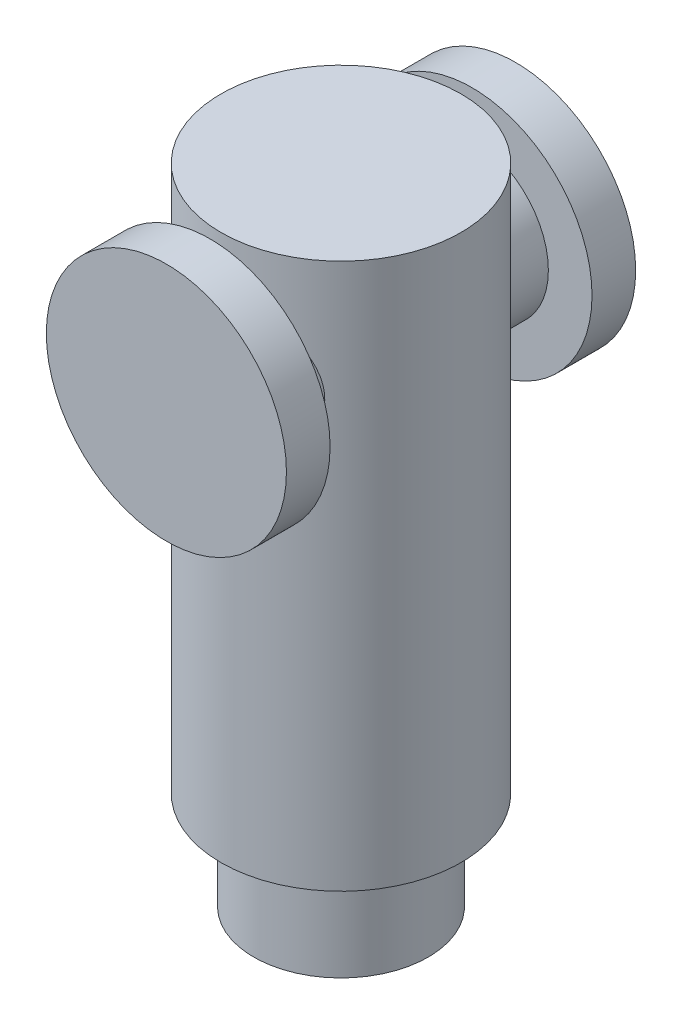
ISO-10303-21;
HEADER;
FILE_DESCRIPTION(('STEP AP214'),'2;1');
FILE_NAME('part.step','',(''),(''),'','','');
FILE_SCHEMA(('AUTOMOTIVE_DESIGN { 1 0 10303 214 1 1 1 1 }'));
ENDSEC;
DATA;
#1=APPLICATION_CONTEXT('core data for automotive mechanical design processes');
#2=APPLICATION_PROTOCOL_DEFINITION('international standard','automotive_design',2000,#1);
#3=PRODUCT_CONTEXT('',#1,'mechanical');
#4=PRODUCT('Part','Part','',(#3));
#5=PRODUCT_RELATED_PRODUCT_CATEGORY('part','',(#4));
#6=PRODUCT_DEFINITION_FORMATION('','',#4);
#7=PRODUCT_DEFINITION_CONTEXT('part definition',#1,'design');
#8=PRODUCT_DEFINITION('design','',#6,#7);
#9=PRODUCT_DEFINITION_SHAPE('','',#8);
#10=(LENGTH_UNIT() NAMED_UNIT(*) SI_UNIT(.MILLI.,.METRE.));
#11=(NAMED_UNIT(*) PLANE_ANGLE_UNIT() SI_UNIT($,.RADIAN.));
#12=(NAMED_UNIT(*) SI_UNIT($,.STERADIAN.) SOLID_ANGLE_UNIT());
#13=UNCERTAINTY_MEASURE_WITH_UNIT(LENGTH_MEASURE(1.E-05),#10,'distance_accuracy_value','');
#14=(GEOMETRIC_REPRESENTATION_CONTEXT(3) GLOBAL_UNCERTAINTY_ASSIGNED_CONTEXT((#13)) GLOBAL_UNIT_ASSIGNED_CONTEXT((#10,
#11,#12)) REPRESENTATION_CONTEXT('',''));
#15=CARTESIAN_POINT('',(0.,0.,0.));
#16=DIRECTION('',(0.,0.,1.));
#17=DIRECTION('',(1.,0.,0.));
#18=AXIS2_PLACEMENT_3D('',#15,#16,#17);
#19=CARTESIAN_POINT('',(0.,-123.825,50.8));
#20=DIRECTION('',(0.,1.,0.));
#21=DIRECTION('',(0.,0.,1.));
#22=AXIS2_PLACEMENT_3D('',#19,#20,#21);
#23=CYLINDRICAL_SURFACE('',#22,34.925);
#24=CARTESIAN_POINT('',(-22.225,0.,23.8592316367925));
#25=CARTESIAN_POINT('',(-22.224993102515,0.550048961014275,23.859220614405));
#26=CARTESIAN_POINT('',(-22.2045369258804,1.1002347247704,23.8423097993652));
#27=CARTESIAN_POINT('',(-22.12310227704,2.19565709118851,23.7754440208732));
#28=CARTESIAN_POINT('',(-22.06210983798,2.74089192233828,23.7254776680933));
#29=CARTESIAN_POINT('',(-21.900633637617,3.82261986102055,23.5946947164049));
#30=CARTESIAN_POINT('',(-21.8000845362128,4.35909696757843,23.5138270808121));
#31=CARTESIAN_POINT('',(-21.5611949876428,5.41852738849376,23.3246724095197));
#32=CARTESIAN_POINT('',(-21.4228559030417,5.94148118970669,23.2163863624352));
#33=CARTESIAN_POINT('',(-21.1117064849993,6.96640493792258,22.9775353914796));
#34=CARTESIAN_POINT('',(-20.9392131831509,7.46851999012526,22.8471768548312));
#35=CARTESIAN_POINT('',(-20.5608502133487,8.45464672088827,22.5677073394826));
#36=CARTESIAN_POINT('',(-20.3549755938499,8.93865570059527,22.4185935795043));
#37=CARTESIAN_POINT('',(-19.9116023540889,9.88699702012034,22.1057969155125));
#38=CARTESIAN_POINT('',(-19.6741052037364,10.3513302732033,21.9421146888022));
#39=CARTESIAN_POINT('',(-19.1689745683395,11.2592609687085,21.6041373372305));
#40=CARTESIAN_POINT('',(-18.9013391603324,11.7028570854456,21.4298415354993));
#41=CARTESIAN_POINT('',(-18.2977693009565,12.6288925837292,21.0495107354197));
#42=CARTESIAN_POINT('',(-17.9575168923452,13.1080981897724,20.8424439254572));
#43=CARTESIAN_POINT('',(-17.2410868254685,14.0370817934533,20.4244739692402));
#44=CARTESIAN_POINT('',(-16.864906869514,14.4868579058706,20.2135705783224));
#45=CARTESIAN_POINT('',(-16.077648711539,15.3559055713792,19.7925130671408));
#46=CARTESIAN_POINT('',(-15.6665424034977,15.7751520430185,19.5823596948737));
#47=CARTESIAN_POINT('',(-14.8109571761003,16.5810609519896,19.16746513127));
#48=CARTESIAN_POINT('',(-14.3664762490929,16.9677214261355,18.9627242665262));
#49=CARTESIAN_POINT('',(-13.3869163709211,17.7534149161709,18.5375429658751));
#50=CARTESIAN_POINT('',(-12.8475019001723,18.1477774273202,18.3184132214909));
#51=CARTESIAN_POINT('',(-11.7302346104613,18.8891955592469,17.8984286411666));
#52=CARTESIAN_POINT('',(-11.1523777145994,19.2362461505573,17.6975757488905));
#53=CARTESIAN_POINT('',(-9.96176230458584,19.8789119295423,17.3200272411961));
#54=CARTESIAN_POINT('',(-9.34903103219786,20.1745665521315,17.1433131271655));
#55=CARTESIAN_POINT('',(-8.09240851163621,20.7106225354938,16.8192808999212));
#56=CARTESIAN_POINT('',(-7.44852322022796,20.9510344087439,16.6719571945332));
#57=CARTESIAN_POINT('',(-6.20358436707441,21.35059246638,16.4251426913929));
#58=CARTESIAN_POINT('',(-5.60508359892887,21.5156046512666,16.3222626643826));
#59=CARTESIAN_POINT('',(-4.39209600151942,21.7955821259867,16.1468549453381));
#60=CARTESIAN_POINT('',(-3.77761018488141,21.910550577864,16.0743253356053));
#61=CARTESIAN_POINT('',(-2.53876136454957,22.088380667769,15.9618482115813));
#62=CARTESIAN_POINT('',(-1.91440798819448,22.1512902420986,15.9218707235363));
#63=CARTESIAN_POINT('',(-0.661399401132223,22.2240150112403,15.8756385162142));
#64=CARTESIAN_POINT('',(-0.0327447232909562,22.2338366677247,15.8693796928215));
#65=CARTESIAN_POINT('',(1.13509360208721,22.2025774787595,15.8892652665267));
#66=CARTESIAN_POINT('',(1.67455382407458,22.168390023258,15.911021637299));
#67=CARTESIAN_POINT('',(2.7479632789904,22.0610554004649,15.979123661276));
#68=CARTESIAN_POINT('',(3.28191314807847,21.987912782944,16.0254664429068));
#69=CARTESIAN_POINT('',(4.34060492971228,21.8036356960906,16.1416903327281));
#70=CARTESIAN_POINT('',(4.86534646306168,21.6924996660433,16.2115724078774));
#71=CARTESIAN_POINT('',(5.90224394407944,21.4336118770418,16.3733459300135));
#72=CARTESIAN_POINT('',(6.41439935629093,21.2858585632164,16.4652383116132));
#73=CARTESIAN_POINT('',(7.42357336161696,20.9552708167758,16.6692009202414));
#74=CARTESIAN_POINT('',(7.92057923080864,20.7724077881768,16.781287590394));
#75=CARTESIAN_POINT('',(8.89653825638289,20.3735161827518,17.0233802736741));
#76=CARTESIAN_POINT('',(9.37549165842615,20.1574880574444,17.1533860428435));
#77=CARTESIAN_POINT('',(10.3133713777729,19.6941263688406,17.4289209764172));
#78=CARTESIAN_POINT('',(10.772296422918,19.4467908208442,17.5744511248806));
#79=CARTESIAN_POINT('',(11.6685131113872,18.9226314768385,17.8784962766893));
#80=CARTESIAN_POINT('',(12.1058023272885,18.6458043829743,18.0370127317531));
#81=CARTESIAN_POINT('',(13.0113109977389,18.0275834010166,18.3851042232282));
#82=CARTESIAN_POINT('',(13.4764458853759,17.6824516444775,18.5760715921434));
#83=CARTESIAN_POINT('',(14.3760966847397,16.959118360221,18.967247473011));
#84=CARTESIAN_POINT('',(14.8106103881346,16.5809144518118,19.1674566497423));
#85=CARTESIAN_POINT('',(15.6483338845236,15.7927664392504,19.5733736598724));
#86=CARTESIAN_POINT('',(16.0514991885256,15.382778817619,19.7790887704052));
#87=CARTESIAN_POINT('',(16.824665721715,14.5331079450793,20.1915328390883));
#88=CARTESIAN_POINT('',(17.1946653018899,14.0934232195233,20.3982618471117));
#89=CARTESIAN_POINT('',(17.9487718541918,13.123255021066,20.8364795014422));
#90=CARTESIAN_POINT('',(18.3278244150003,12.5885991226055,21.067464540297));
#91=CARTESIAN_POINT('',(19.0392542903089,11.4842887191789,21.5179276993371));
#92=CARTESIAN_POINT('',(19.3716223419018,10.9146273007334,21.7374035305246));
#93=CARTESIAN_POINT('',(19.9864417431298,9.74318701820823,22.1567450183205));
#94=CARTESIAN_POINT('',(20.2689659087052,9.14145670589559,22.3566390883055));
#95=CARTESIAN_POINT('',(20.7812995632231,7.90783081716129,22.728776912615));
#96=CARTESIAN_POINT('',(21.0111322582446,7.27594866875076,22.9010328291069));
#97=CARTESIAN_POINT('',(21.3600078939959,6.15990238769129,23.1677716995915));
#98=CARTESIAN_POINT('',(21.4922147724762,5.681838121522,23.2707022165474));
#99=CARTESIAN_POINT('',(21.725053200077,4.71384603253641,23.4540734196694));
#100=CARTESIAN_POINT('',(21.8256898881739,4.22392015454641,23.5345177658882));
#101=CARTESIAN_POINT('',(21.9939225571027,3.23557484086419,23.6700406507584));
#102=CARTESIAN_POINT('',(22.0615598437196,2.7371668356994,23.725150895417));
#103=CARTESIAN_POINT('',(22.1629312681206,1.73462093860049,23.8080673804937));
#104=CARTESIAN_POINT('',(22.1966649675792,1.2304829726713,23.8358732679049));
#105=CARTESIAN_POINT('',(22.2296991441713,0.218887150793668,23.8631001008513));
#106=CARTESIAN_POINT('',(22.2289028329067,-0.288576049991101,23.8624412591281));
#107=CARTESIAN_POINT('',(22.1926510348579,-1.30140884727344,23.8325677651242));
#108=CARTESIAN_POINT('',(22.1571953591136,-1.80677843234169,23.8033529571585));
#109=CARTESIAN_POINT('',(22.052191168074,-2.81194899769108,23.7175138874566));
#110=CARTESIAN_POINT('',(21.9826180025756,-3.31174568406993,23.6608698081884));
#111=CARTESIAN_POINT('',(21.8104520386654,-4.30202581011538,23.5223173817588));
#112=CARTESIAN_POINT('',(21.7078584841568,-4.79250903625114,23.4404084560877));
#113=CARTESIAN_POINT('',(21.4739899915268,-5.74934150522806,23.2564907305975));
#114=CARTESIAN_POINT('',(21.343490385679,-6.2159875983063,23.1550314537962));
#115=CARTESIAN_POINT('',(21.0537681900143,-7.1359772505938,22.9337537759347));
#116=CARTESIAN_POINT('',(20.8945343028499,-7.58931549580622,22.8139281566507));
#117=CARTESIAN_POINT('',(20.5487429300828,-8.48106944679503,22.5590563420105));
#118=CARTESIAN_POINT('',(20.3621820398113,-8.9194832847407,22.4240082505718));
#119=CARTESIAN_POINT('',(19.9630887159406,-9.78011667017701,22.1418349792712));
#120=CARTESIAN_POINT('',(19.7505624295536,-10.2023400197263,21.9947126606353));
#121=CARTESIAN_POINT('',(19.2569145805761,-11.1102760789994,21.6618494188127));
#122=CARTESIAN_POINT('',(18.9704869812529,-11.5923946553862,21.4741573153747));
#123=CARTESIAN_POINT('',(18.3637747106605,-12.5313572072767,21.0904685100924));
#124=CARTESIAN_POINT('',(18.0434868472823,-12.9881987936469,20.8944710263203));
#125=CARTESIAN_POINT('',(17.3700590359473,-13.8759644778869,20.4983593996552));
#126=CARTESIAN_POINT('',(17.0168842444534,-14.3068602720873,20.2982410696105));
#127=CARTESIAN_POINT('',(16.2791475546546,-15.1410049550641,19.8982023034146));
#128=CARTESIAN_POINT('',(15.8945838182775,-15.5442522222516,19.6982818795471));
#129=CARTESIAN_POINT('',(15.0248360729649,-16.39007992796,19.267717047191));
#130=CARTESIAN_POINT('',(14.5338474920954,-16.8271146451696,19.0378492112924));
#131=CARTESIAN_POINT('',(13.5117371785278,-17.6583559255328,18.5897529870178));
#132=CARTESIAN_POINT('',(12.9806088881448,-18.0525554648823,18.3715265104855));
#133=CARTESIAN_POINT('',(11.8809762197442,-18.7944808655999,17.9527192906435));
#134=CARTESIAN_POINT('',(11.3125058567456,-19.1422481698942,17.7521228670963));
#135=CARTESIAN_POINT('',(10.140730521011,-19.7879605255678,17.3739638354318));
#136=CARTESIAN_POINT('',(9.53743540401984,-20.0859195810663,17.1963947560908));
#137=CARTESIAN_POINT('',(8.42396258186132,-20.5737529193776,16.9022937936171));
#138=CARTESIAN_POINT('',(7.91935795569271,-20.7733208967428,16.7806616258108));
#139=CARTESIAN_POINT('',(6.89284958569175,-21.1361172739067,16.5579216896085));
#140=CARTESIAN_POINT('',(6.37094803376168,-21.2993502580749,16.4568113321271));
#141=CARTESIAN_POINT('',(5.31319069150736,-21.5875172240666,16.2773524171228));
#142=CARTESIAN_POINT('',(4.77734407406779,-21.712475724369,16.1989892895066));
#143=CARTESIAN_POINT('',(3.69489863071421,-21.922643200075,16.0667219094213));
#144=CARTESIAN_POINT('',(3.14829959430638,-22.0078513965015,16.0128181362768));
#145=CARTESIAN_POINT('',(2.04659733782736,-22.1375396293118,15.9306276225539));
#146=CARTESIAN_POINT('',(1.49147266580254,-22.1818898124477,15.9024225596522));
#147=CARTESIAN_POINT('',(0.37874048664512,-22.2287485838244,15.872619131986));
#148=CARTESIAN_POINT('',(-0.178867020203917,-22.231257176844,15.8710207641829));
#149=CARTESIAN_POINT('',(-1.29217446134067,-22.1943946132157,15.8944710254405));
#150=CARTESIAN_POINT('',(-1.84787422522302,-22.1550198082887,15.9195219758067));
#151=CARTESIAN_POINT('',(-2.95296714429111,-22.0349612071521,15.9956559885077));
#152=CARTESIAN_POINT('',(-3.50236043813065,-21.9542783209257,16.046738477389));
#153=CARTESIAN_POINT('',(-4.56406753519378,-21.7576876619502,16.1705839091323));
#154=CARTESIAN_POINT('',(-5.07687841434795,-21.6437014935133,16.2421607066148));
#155=CARTESIAN_POINT('',(-6.08998531361785,-21.3807526515531,16.4062355812097));
#156=CARTESIAN_POINT('',(-6.5902818397733,-21.2317913948468,16.4987328108441));
#157=CARTESIAN_POINT('',(-7.57568828178368,-20.9004740385646,16.7028184454793));
#158=CARTESIAN_POINT('',(-8.06079731093594,-20.7181159934014,16.814407962709));
#159=CARTESIAN_POINT('',(-9.01354184870091,-20.3217358857991,17.0545840552191));
#160=CARTESIAN_POINT('',(-9.48117638835194,-20.1077120707445,17.1831715712511));
#161=CARTESIAN_POINT('',(-10.4327108412351,-19.6319555114842,17.4656449308048));
#162=CARTESIAN_POINT('',(-10.9150494726646,-19.3678074322198,17.6207203089776));
#163=CARTESIAN_POINT('',(-11.8553879171509,-18.8069182522125,17.944972841617));
#164=CARTESIAN_POINT('',(-12.313386710121,-18.5101757870293,18.114150586354));
#165=CARTESIAN_POINT('',(-13.2038693952338,-17.8858698909712,18.4636059812388));
#166=CARTESIAN_POINT('',(-13.636336230109,-17.5582862266337,18.6438908910958));
#167=CARTESIAN_POINT('',(-14.474262082793,-16.8742095077936,19.0122527777414));
#168=CARTESIAN_POINT('',(-14.8797184743696,-16.5177136496021,19.2003305093527));
#169=CARTESIAN_POINT('',(-15.7219752406828,-15.7211685170545,19.6098360632766));
#170=CARTESIAN_POINT('',(-16.1542012867281,-15.2766477835287,19.8319952733907));
#171=CARTESIAN_POINT('',(-16.9799736909424,-14.3532180374692,20.276957015812));
#172=CARTESIAN_POINT('',(-17.3735141820297,-13.8743038277955,20.4997596404416));
#173=CARTESIAN_POINT('',(-18.1203696990778,-12.883624101706,20.9403973822958));
#174=CARTESIAN_POINT('',(-18.4736714998372,-12.371847870498,21.1582308476088));
#175=CARTESIAN_POINT('',(-19.1379341721169,-11.3171710795627,21.5827034208351));
#176=CARTESIAN_POINT('',(-19.4489031019026,-10.7742764714062,21.7893446547213));
#177=CARTESIAN_POINT('',(-19.9837568544207,-9.74099447777374,22.155729704317));
#178=CARTESIAN_POINT('',(-20.213723599693,-9.25461284201752,22.3179030477009));
#179=CARTESIAN_POINT('',(-20.639443732139,-8.26170009638607,22.6248712968767));
#180=CARTESIAN_POINT('',(-20.8351967406032,-7.7551687635514,22.7696660103002));
#181=CARTESIAN_POINT('',(-21.1900987686774,-6.72506047749812,23.0369917577994));
#182=CARTESIAN_POINT('',(-21.3493306574681,-6.20152525442457,23.1595730602974));
#183=CARTESIAN_POINT('',(-21.6296692185328,-5.13902455033955,23.3783885676936));
#184=CARTESIAN_POINT('',(-21.7507903990284,-4.60006502659767,23.4746327969303));
#185=CARTESIAN_POINT('',(-21.9134881752136,-3.72339838363474,23.605132784887));
#186=CARTESIAN_POINT('',(-21.967650931732,-3.38937856324423,23.6489133074894));
#187=CARTESIAN_POINT('',(-22.0607900904761,-2.71790243307062,23.7245352517624));
#188=CARTESIAN_POINT('',(-22.0997684757196,-2.38044657793042,23.7563782324074));
#189=CARTESIAN_POINT('',(-22.1622616302709,-1.70308019404077,23.8075672215643));
#190=CARTESIAN_POINT('',(-22.1857729900991,-1.36316914076216,23.8269104746772));
#191=CARTESIAN_POINT('',(-22.217143669646,-0.682189531586664,23.8527455712843));
#192=CARTESIAN_POINT('',(-22.2250042775783,-0.34112107327083,23.8592384724907));
#193=CARTESIAN_POINT('',(-22.225,0.,23.8592316367925));
#194=B_SPLINE_CURVE_WITH_KNOTS('',3,(#24,#25,#26,#27,#28,#29,#30,#31,#32,#33,#34,#35,#36,#37,
#38,#39,#40,#41,#42,#43,#44,#45,#46,#47,#48,#49,#50,#51,#52,#53,#54,#55,#56,#57,#58,#59,#60,#61,
#62,#63,#64,#65,#66,#67,#68,#69,#70,#71,#72,#73,#74,#75,#76,#77,#78,#79,#80,#81,#82,#83,#84,#85,
#86,#87,#88,#89,#90,#91,#92,#93,#94,#95,#96,#97,#98,#99,#100,#101,#102,#103,#104,#105,#106,#107,
#108,#109,#110,#111,#112,#113,#114,#115,#116,#117,#118,#119,#120,#121,#122,#123,#124,#125,#126,
#127,#128,#129,#130,#131,#132,#133,#134,#135,#136,#137,#138,#139,#140,#141,#142,#143,#144,#145,
#146,#147,#148,#149,#150,#151,#152,#153,#154,#155,#156,#157,#158,#159,#160,#161,#162,#163,#164,
#165,#166,#167,#168,#169,#170,#171,#172,#173,#174,#175,#176,#177,#178,#179,#180,#181,#182,#183,
#184,#185,#186,#187,#188,#189,#190,#191,#192,#193),.UNSPECIFIED.,.T.,.F.,(4,2,2,2,2,2,2,2,2,2,2,
2,2,2,2,2,2,2,2,2,2,2,2,2,2,2,2,2,2,2,2,2,2,2,2,2,2,2,2,2,2,2,2,2,2,2,2,2,2,2,2,2,2,2,2,2,2,2,2,
2,2,2,2,2,2,2,2,2,2,2,2,2,2,2,2,2,2,2,2,2,2,2,2,2,4),(0.,1.64975508046686,3.3000788823984,
4.95314022984839,6.60614198198793,8.2444642613135,9.88302978029807,11.5215191604333,
13.1601131432027,15.0276748801399,16.8953561340921,18.7645548536416,20.6338661051225,
22.7406968109198,24.8477513078146,26.9531819065244,29.0582115176932,30.9433270182616,
32.8283233893571,34.7115821006467,36.5946115832291,38.215598717319,39.8363965696167,
41.4572610099672,43.0781942885011,44.7004534203778,46.3226904683309,47.9450304077907,
49.5675519541671,51.3953149591178,53.2232096436789,55.0536528057284,56.8841869276921,
58.9663959543151,61.0490175406084,63.1285710088091,65.2072068448772,66.725476707886,
68.2434992994539,69.7596168558827,71.2757540133174,72.7961412113475,74.316536698461,
75.8380323075221,77.3595627580803,78.84331713807,80.3276561561666,81.8121802654747,
83.2963535977248,85.0687561626314,86.8413259665151,88.6157956440683,90.3903693055748,
92.4768762566523,94.5637248234867,96.6486981487374,98.7330842719691,100.399684006488,
102.066073347543,103.731392962969,105.396745211891,107.067372137292,108.737998871893,
110.408771139379,112.079506602703,113.668303782144,115.257036611598,116.845862024872,
118.43477540829,120.147199630327,121.859695563849,123.573322920142,125.287116650393,
127.26086461317,129.234911455778,131.209605244999,133.183922614585,134.868146219576,
136.552388465942,138.232770373396,139.91251180647,140.935624501472,141.958603537241,
142.981807998286,144.004928235883),.UNSPECIFIED.);
#195=CARTESIAN_POINT('',(-22.225,0.,23.8592316367925));
#196=VERTEX_POINT('',#195);
#197=EDGE_CURVE('E87',#196,#196,#194,.T.);
#198=ORIENTED_EDGE('',*,*,#197,.F.);
#199=EDGE_LOOP('',(#198));
#200=FACE_BOUND('',#199,.T.);
#201=CARTESIAN_POINT('',(0.,34.925,50.8));
#202=DIRECTION('',(0.,1.,0.));
#203=DIRECTION('',(0.,0.,1.));
#204=AXIS2_PLACEMENT_3D('',#201,#202,#203);
#205=CIRCLE('',#204,34.925);
#206=CARTESIAN_POINT('',(0.,34.925,85.725));
#207=VERTEX_POINT('',#206);
#208=EDGE_CURVE('E80',#207,#207,#205,.T.);
#209=ORIENTED_EDGE('',*,*,#208,.F.);
#210=EDGE_LOOP('',(#209));
#211=FACE_BOUND('',#210,.T.);
#212=CARTESIAN_POINT('',(0.,-123.825,50.8));
#213=DIRECTION('',(0.,1.,0.));
#214=DIRECTION('',(0.,0.,1.));
#215=AXIS2_PLACEMENT_3D('',#212,#213,#214);
#216=CIRCLE('',#215,34.925);
#217=CARTESIAN_POINT('',(0.,-123.825,85.725));
#218=VERTEX_POINT('',#217);
#219=EDGE_CURVE('E84',#218,#218,#216,.T.);
#220=ORIENTED_EDGE('',*,*,#219,.T.);
#221=EDGE_LOOP('',(#220));
#222=FACE_BOUND('',#221,.T.);
#223=CARTESIAN_POINT('',(0.,-22.225,85.725));
#224=CARTESIAN_POINT('',(-0.563065938500619,-22.2250032011339,85.725002469431));
#225=CARTESIAN_POINT('',(-1.12608869369748,-22.2035777848322,85.711356082804));
#226=CARTESIAN_POINT('',(-2.24782029999062,-22.1181915629029,85.6571127129998));
#227=CARTESIAN_POINT('',(-2.80652739311927,-22.0542142620221,85.6165052783736));
#228=CARTESIAN_POINT('',(-3.91587181104936,-21.8845140969386,85.5092586499793));
#229=CARTESIAN_POINT('',(-4.46649563159159,-21.7787281512163,85.4425801213798));
#230=CARTESIAN_POINT('',(-5.55479838432931,-21.5268854138247,85.2848107323423));
#231=CARTESIAN_POINT('',(-6.09247839752284,-21.3808319978556,85.1937219182839));
#232=CARTESIAN_POINT('',(-7.14882198146857,-21.0511190722694,84.9897343309559));
#233=CARTESIAN_POINT('',(-7.66756747661155,-20.8676520591336,84.8769473585156));
#234=CARTESIAN_POINT('',(-8.68602413650871,-20.4646904991226,84.6316864177102));
#235=CARTESIAN_POINT('',(-9.18573496913077,-20.2451953239536,84.499212106022));
#236=CARTESIAN_POINT('',(-10.1636723369952,-19.7723375448842,84.2172757115268));
#237=CARTESIAN_POINT('',(-10.6419042750654,-19.5189835223513,84.0678179345323));
#238=CARTESIAN_POINT('',(-11.5752212373589,-18.9803909398237,83.7546996405363));
#239=CARTESIAN_POINT('',(-12.0303036741381,-18.6951488270073,83.5910375414109));
#240=CARTESIAN_POINT('',(-12.9518115508298,-18.0703011132921,83.2386941668328));
#241=CARTESIAN_POINT('',(-13.4161544443977,-17.728161534114,83.0490605066196));
#242=CARTESIAN_POINT('',(-14.3145452600114,-17.0110208671661,82.6604613595453));
#243=CARTESIAN_POINT('',(-14.7485918207228,-16.6360183044375,82.4614954540202));
#244=CARTESIAN_POINT('',(-15.5856771867294,-15.8545129983049,82.0579341691412));
#245=CARTESIAN_POINT('',(-15.988675373221,-15.4479703420775,81.8533318753495));
#246=CARTESIAN_POINT('',(-16.7618776868694,-14.6053784607227,81.4428898425488));
#247=CARTESIAN_POINT('',(-17.1320799117901,-14.1693275266361,81.2370500324997));
#248=CARTESIAN_POINT('',(-17.8884781728046,-13.205288006405,80.799580638446));
#249=CARTESIAN_POINT('',(-18.2695193025539,-12.6730230023022,80.5684252802145));
#250=CARTESIAN_POINT('',(-18.9851445542641,-11.5734720212738,80.1172118999981));
#251=CARTESIAN_POINT('',(-19.3197194839212,-11.006179146838,79.8971560792774));
#252=CARTESIAN_POINT('',(-19.9392385086907,-9.83936517708744,79.4761657702838));
#253=CARTESIAN_POINT('',(-20.2242500676471,-9.23988936685009,79.2752054617201));
#254=CARTESIAN_POINT('',(-20.7418475227638,-8.01065695945402,78.9004195734711));
#255=CARTESIAN_POINT('',(-20.9744560873963,-7.38091359901941,78.726582270967));
#256=CARTESIAN_POINT('',(-21.3288538384394,-6.26697816742384,78.4563036234918));
#257=CARTESIAN_POINT('',(-21.4636439151109,-5.78889487400131,78.3515965118783));
#258=CARTESIAN_POINT('',(-21.701624669656,-4.82063329864995,78.164540351455));
#259=CARTESIAN_POINT('',(-21.8048204334495,-4.33045697714836,78.0821877043595));
#260=CARTESIAN_POINT('',(-21.9781175369952,-3.34136439332612,77.9427775466589));
#261=CARTESIAN_POINT('',(-22.0482611420435,-2.84246014361626,77.8856877370402));
#262=CARTESIAN_POINT('',(-22.1545640171699,-1.83864527537511,77.7988086370871));
#263=CARTESIAN_POINT('',(-22.190722888093,-1.33373458636794,77.7690196674046));
#264=CARTESIAN_POINT('',(-22.2284954011221,-0.320214870552671,77.7378959064639));
#265=CARTESIAN_POINT('',(-22.2300050439282,0.188400707806728,77.7366467772928));
#266=CARTESIAN_POINT('',(-22.1981876737389,1.20378887771057,77.7628726265756));
#267=CARTESIAN_POINT('',(-22.1648604847393,1.71056145993076,77.7903477501515));
#268=CARTESIAN_POINT('',(-22.0639063879624,2.71873657680392,77.8729362868909));
#269=CARTESIAN_POINT('',(-21.9962551008517,3.22013503555408,77.9280693443061));
#270=CARTESIAN_POINT('',(-21.8277067247013,4.21376501186629,78.0638682012321));
#271=CARTESIAN_POINT('',(-21.7268089280119,4.70599633407081,78.1445345442157));
#272=CARTESIAN_POINT('',(-21.4964838319826,5.66461897147706,78.3259446233168));
#273=CARTESIAN_POINT('',(-21.3679490151245,6.13134707501204,78.4260524770032));
#274=CARTESIAN_POINT('',(-21.0821534445896,7.05164580291191,78.6447623824));
#275=CARTESIAN_POINT('',(-20.9248814044504,7.50521117625964,78.7633716978192));
#276=CARTESIAN_POINT('',(-20.5830085949,8.39754229007648,79.0159622942747));
#277=CARTESIAN_POINT('',(-20.3984044338857,8.83630618554345,79.1499454825676));
#278=CARTESIAN_POINT('',(-20.0032213406291,9.69774719666625,79.4301487151765));
#279=CARTESIAN_POINT('',(-19.7926485573987,10.1204280896561,79.5763658600335));
#280=CARTESIAN_POINT('',(-19.3037800683395,11.0285655368826,79.9070896866341));
#281=CARTESIAN_POINT('',(-19.0202441982024,11.5104926903013,80.0935576995106));
#282=CARTESIAN_POINT('',(-18.4194508631515,12.4493014182524,80.4750079411747));
#283=CARTESIAN_POINT('',(-18.1021902612183,12.906180656867,80.6699909610186));
#284=CARTESIAN_POINT('',(-17.4349591462263,13.794259644575,81.0643046790497));
#285=CARTESIAN_POINT('',(-17.0849541920273,14.2254315559861,81.2636397820544));
#286=CARTESIAN_POINT('',(-16.3536915520201,15.060392161435,81.6623699594367));
#287=CARTESIAN_POINT('',(-15.9724320109541,15.4641792273178,81.8617650366736));
#288=CARTESIAN_POINT('',(-15.1090005140763,16.3124924240099,82.2919979064078));
#289=CARTESIAN_POINT('',(-14.6209574464125,16.7514426590518,82.5221018660592));
#290=CARTESIAN_POINT('',(-13.6047142072478,17.5867861785023,82.9710429909231));
#291=CARTESIAN_POINT('',(-13.0765074527226,17.9831724606768,83.1898782992472));
#292=CARTESIAN_POINT('',(-11.982636189629,18.7297928281911,83.6102890333408));
#293=CARTESIAN_POINT('',(-11.4170045912161,19.0800666736417,83.8118792753119));
#294=CARTESIAN_POINT('',(-10.2507818015523,19.7311370307489,84.1924092382327));
#295=CARTESIAN_POINT('',(-9.6502003468918,20.0319472338604,84.3713552239045));
#296=CARTESIAN_POINT('',(-8.53994687280201,20.525898307145,84.6686693590568));
#297=CARTESIAN_POINT('',(-8.03582562025696,20.7285643020848,84.7920161266873));
#298=CARTESIAN_POINT('',(-7.01000741301834,21.0975687771579,85.0182866755196));
#299=CARTESIAN_POINT('',(-6.48831264959547,21.2639117672559,85.1212129920357));
#300=CARTESIAN_POINT('',(-5.43067023252975,21.5582827962907,85.3043661724237));
#301=CARTESIAN_POINT('',(-4.89473194755774,21.6863353732696,85.3846075718992));
#302=CARTESIAN_POINT('',(-3.81178968733269,21.902642373637,85.5206518318463));
#303=CARTESIAN_POINT('',(-3.26478550286778,21.9908960438515,85.5764542298216));
#304=CARTESIAN_POINT('',(-2.16189378442263,22.1266022428977,85.6624261101471));
#305=CARTESIAN_POINT('',(-1.60598302934767,22.1739202397679,85.6925110702796));
#306=CARTESIAN_POINT('',(-0.491367241564437,22.2265709944643,85.7259937965618));
#307=CARTESIAN_POINT('',(0.0673377913762283,22.2319037487987,85.7293915604921));
#308=CARTESIAN_POINT('',(1.18311712755681,22.2005040466905,85.7094147187851));
#309=CARTESIAN_POINT('',(1.74019131189396,22.1637685961005,85.6860382075249));
#310=CARTESIAN_POINT('',(2.84827982752026,22.0487684562233,85.6130897110027));
#311=CARTESIAN_POINT('',(3.3992943035723,21.9705047612312,85.5635183529139));
#312=CARTESIAN_POINT('',(4.46324434890689,21.7785955960559,85.4425603727622));
#313=CARTESIAN_POINT('',(4.9766872390023,21.6669617759084,85.372417504749));
#314=CARTESIAN_POINT('',(5.9912541446549,21.4086317986976,85.2111077879222));
#315=CARTESIAN_POINT('',(6.49237867641296,21.2619371136317,85.1199418217493));
#316=CARTESIAN_POINT('',(7.47961381176666,20.9350524228514,84.918394846759));
#317=CARTESIAN_POINT('',(7.96572343134946,20.7548602272624,84.8080125817205));
#318=CARTESIAN_POINT('',(8.92061084870213,20.3627055395401,84.570112315536));
#319=CARTESIAN_POINT('',(9.38938768938884,20.150741296271,84.4425933699315));
#320=CARTESIAN_POINT('',(10.342491938775,19.6796105806626,84.1624567175154));
#321=CARTESIAN_POINT('',(10.8253090707819,19.4180852496003,84.0086696621102));
#322=CARTESIAN_POINT('',(11.7668062733227,18.8624427546422,83.6868583581985));
#323=CARTESIAN_POINT('',(12.2254853707092,18.5683242782058,83.518833536395));
#324=CARTESIAN_POINT('',(13.1175100936279,17.9492753285257,83.1715273552458));
#325=CARTESIAN_POINT('',(13.550839279087,17.6243252105467,82.9922388440223));
#326=CARTESIAN_POINT('',(14.3906742861262,16.9455217618657,82.6256830192737));
#327=CARTESIAN_POINT('',(14.7971774335709,16.5916655575246,82.4384149133611));
#328=CARTESIAN_POINT('',(15.6418361104003,15.8008582901551,82.0304430559873));
#329=CARTESIAN_POINT('',(16.0754507665388,15.3594417471923,81.8089735690056));
#330=CARTESIAN_POINT('',(16.9042563631331,14.4422598428354,81.3650584384952));
#331=CARTESIAN_POINT('',(17.2994417681941,13.9664895502341,81.1426126591487));
#332=CARTESIAN_POINT('',(18.0498219875274,12.9822034040766,80.702321168786));
#333=CARTESIAN_POINT('',(18.4050089014998,12.4736811125808,80.4844763734121));
#334=CARTESIAN_POINT('',(19.0733825355243,11.425538023659,80.0595027534787));
#335=CARTESIAN_POINT('',(19.3865759522084,10.885922204335,79.8523722235769));
#336=CARTESIAN_POINT('',(19.92740508607,9.85585395937123,79.4835426782788));
#337=CARTESIAN_POINT('',(20.1608755197791,9.36927747994476,79.3195659298123));
#338=CARTESIAN_POINT('',(20.5934411702252,8.37581116916943,79.008805905947));
#339=CARTESIAN_POINT('',(20.7925431339397,7.86892534893689,78.8620192577317));
#340=CARTESIAN_POINT('',(21.154243665006,6.83718146828212,78.590371713202));
#341=CARTESIAN_POINT('',(21.3168823099817,6.31234387788879,78.4654867774585));
#342=CARTESIAN_POINT('',(21.6038541426698,5.24675999587176,78.2419798888252));
#343=CARTESIAN_POINT('',(21.7281877906617,4.70601389549302,78.1433576203605));
#344=CARTESIAN_POINT('',(21.9375352867528,3.60705733069044,77.9756953004574));
#345=CARTESIAN_POINT('',(22.0221740458019,3.04873145555174,77.9069378832696));
#346=CARTESIAN_POINT('',(22.1487843040621,1.92408851499051,77.8035873280659));
#347=CARTESIAN_POINT('',(22.1907567965101,1.35777163590339,77.7689933947517));
#348=CARTESIAN_POINT('',(22.2311323381971,0.222818694405664,77.7357212940897));
#349=CARTESIAN_POINT('',(22.2295582117886,-0.345815996888536,77.7370243118546));
#350=CARTESIAN_POINT('',(22.1829257435553,-1.48004514876384,77.7754396358843));
#351=CARTESIAN_POINT('',(22.1378705311972,-2.04563982519815,77.8125493650306));
#352=CARTESIAN_POINT('',(22.0144525786865,-3.09059829395523,77.9131844170975));
#353=CARTESIAN_POINT('',(21.941569989588,-3.57105137885379,77.972337089733));
#354=CARTESIAN_POINT('',(21.7652750094727,-4.52303289564958,78.1137547165463));
#355=CARTESIAN_POINT('',(21.6618514230813,-4.99455798725801,78.1960281455346));
#356=CARTESIAN_POINT('',(21.4256999310528,-5.92631278590824,78.3811072678466));
#357=CARTESIAN_POINT('',(21.2929563933539,-6.38653632148328,78.4839239110754));
#358=CARTESIAN_POINT('',(20.9995217434967,-7.29369734081288,78.707161642785));
#359=CARTESIAN_POINT('',(20.8388248568504,-7.7406320570368,78.8275863678498));
#360=CARTESIAN_POINT('',(20.5478248692407,-8.47576810312252,79.0411680989163));
#361=CARTESIAN_POINT('',(20.4247899446405,-8.76804242259504,79.1303483569881));
#362=CARTESIAN_POINT('',(20.1671019441367,-9.34551087026966,79.3143595135522));
#363=CARTESIAN_POINT('',(20.0324513504407,-9.63070649446018,79.4091892034569));
#364=CARTESIAN_POINT('',(19.61146552241,-10.4755455084975,79.7009092157702));
#365=CARTESIAN_POINT('',(19.3081318421268,-11.0243514664869,79.9050039662792));
#366=CARTESIAN_POINT('',(18.6584267304861,-12.0915073960425,80.3257297013214));
#367=CARTESIAN_POINT('',(18.3120086257771,-12.6098234269714,80.5423741428434));
#368=CARTESIAN_POINT('',(17.5783672280619,-13.6138952468289,80.9817730859408));
#369=CARTESIAN_POINT('',(17.1911469420628,-14.0996534308694,81.2045271363612));
#370=CARTESIAN_POINT('',(16.3730044651701,-15.0422457624689,81.6528827606989));
#371=CARTESIAN_POINT('',(15.9416423923883,-15.4986961703454,81.878488345963));
#372=CARTESIAN_POINT('',(15.0404279201249,-16.3747068351368,82.3244973588281));
#373=CARTESIAN_POINT('',(14.5705746744309,-16.7942662805987,82.5449006719221));
#374=CARTESIAN_POINT('',(13.5939457449715,-17.5941371359685,82.9752236203791));
#375=CARTESIAN_POINT('',(13.0871663140921,-17.9744445532568,83.1851421881412));
#376=CARTESIAN_POINT('',(12.0386555722387,-18.6929193353582,83.5893587653632));
#377=CARTESIAN_POINT('',(11.4969252034519,-19.0310878354081,83.7836571955848));
#378=CARTESIAN_POINT('',(10.3661694803737,-19.6704350656593,84.1565857064839));
#379=CARTESIAN_POINT('',(9.77627191557647,-19.9703980844701,84.3346650737748));
#380=CARTESIAN_POINT('',(8.56563564981682,-20.5188217997245,84.6641251737242));
#381=CARTESIAN_POINT('',(7.94489203054901,-20.7672742500956,84.8155016310681));
#382=CARTESIAN_POINT('',(6.67913613314402,-21.2081983929302,85.0864771351728));
#383=CARTESIAN_POINT('',(6.0341974537643,-21.4008264169498,85.2061648406331));
#384=CARTESIAN_POINT('',(4.72445835951298,-21.7275149137173,85.4103101929044));
#385=CARTESIAN_POINT('',(4.05967241645867,-21.8616169982061,85.4947928684331));
#386=CARTESIAN_POINT('',(3.10922305740791,-22.0082587185435,85.5874606976359));
#387=CARTESIAN_POINT('',(2.82874765160752,-22.046066292545,85.6113978034508));
#388=CARTESIAN_POINT('',(2.26614967991406,-22.1109775532681,85.6525420880464));
#389=CARTESIAN_POINT('',(1.98402764051735,-22.138084489533,85.6697513099189));
#390=CARTESIAN_POINT('',(1.13583391700532,-22.2031957901376,85.7111110437784));
#391=CARTESIAN_POINT('',(0.567894994907055,-22.224996771412,85.7249975093902));
#392=CARTESIAN_POINT('',(0.,-22.225,85.725));
#393=B_SPLINE_CURVE_WITH_KNOTS('',3,(#223,#224,#225,#226,#227,#228,#229,#230,#231,#232,#233,
#234,#235,#236,#237,#238,#239,#240,#241,#242,#243,#244,#245,#246,#247,#248,#249,#250,#251,#252,
#253,#254,#255,#256,#257,#258,#259,#260,#261,#262,#263,#264,#265,#266,#267,#268,#269,#270,#271,
#272,#273,#274,#275,#276,#277,#278,#279,#280,#281,#282,#283,#284,#285,#286,#287,#288,#289,#290,
#291,#292,#293,#294,#295,#296,#297,#298,#299,#300,#301,#302,#303,#304,#305,#306,#307,#308,#309,
#310,#311,#312,#313,#314,#315,#316,#317,#318,#319,#320,#321,#322,#323,#324,#325,#326,#327,#328,
#329,#330,#331,#332,#333,#334,#335,#336,#337,#338,#339,#340,#341,#342,#343,#344,#345,#346,#347,
#348,#349,#350,#351,#352,#353,#354,#355,#356,#357,#358,#359,#360,#361,#362,#363,#364,#365,#366,
#367,#368,#369,#370,#371,#372,#373,#374,#375,#376,#377,#378,#379,#380,#381,#382,#383,#384,#385,
#386,#387,#388,#389,#390,#391,#392),.UNSPECIFIED.,.T.,.F.,(4,2,2,2,2,2,2,2,2,2,2,2,2,2,2,2,2,2,
2,2,2,2,2,2,2,2,2,2,2,2,2,2,2,2,2,2,2,2,2,2,2,2,2,2,2,2,2,2,2,2,2,2,2,2,2,2,2,2,2,2,2,2,2,2,2,2,
2,2,2,2,2,2,2,2,2,2,2,2,2,2,2,2,2,2,4),(0.,1.68855550257703,3.3777659560996,5.06953490623309,
6.76116207518714,8.44429583462608,10.1274589492974,11.8101962802612,13.4931212811446,
15.3127815244662,17.132523479771,18.9546070397119,20.7767962153014,22.8569431356587,
24.937500982412,27.0152042979251,29.0920071079377,30.6134641139099,32.1346760731773,
33.6539374750097,35.1732167205378,36.6970554726166,38.2209019235427,39.7458322332988,
41.2707950031906,42.7524103545796,44.2346088618164,45.7169914472933,47.1990236965253,
48.965615359153,50.7323714912739,52.501007284486,54.2697481392143,56.3539055181986,
58.4384052401796,60.5210956782564,62.6032086570742,64.2729833545085,65.9425506100708,
67.6110456352005,69.2795722344266,70.9535617117953,72.6275513283808,74.3016600963127,
75.9757287835026,77.5642804092764,79.1527653529102,80.7413541790923,82.3300305935308,
84.0390023041971,85.7480428609503,87.4581797602468,89.1684868766645,91.1380185001171,
93.1078333983141,95.0780366845101,97.0479254110977,98.7385383402477,100.428819001719,
102.117232630508,103.805625970236,105.509667071866,107.213668503863,108.916776824223,
110.619762575816,112.086780737106,113.554337330339,115.022678254661,116.49132286382,
117.479253354251,118.466973249613,120.442711906734,122.420609834846,124.398362099202,
126.398208376274,128.398098630935,130.39819210945,132.398231693116,134.451199598451,
136.504495899951,138.5519852917,140.598016544489,141.449854223084,142.301433018344,
144.004470181433),.UNSPECIFIED.);
#394=CARTESIAN_POINT('',(0.,-22.225,85.725));
#395=VERTEX_POINT('',#394);
#396=EDGE_CURVE('E47',#395,#395,#393,.T.);
#397=ORIENTED_EDGE('',*,*,#396,.T.);
#398=EDGE_LOOP('',(#397));
#399=FACE_BOUND('',#398,.T.);
#400=ADVANCED_FACE('F43',(#200,#211,#222,#399),#23,.T.);
#401=CARTESIAN_POINT('',(0.,0.,12.7));
#402=DIRECTION('',(0.,0.,-1.));
#403=DIRECTION('',(-1.,0.,0.));
#404=AXIS2_PLACEMENT_3D('',#401,#402,#403);
#405=CYLINDRICAL_SURFACE('',#404,34.925);
#406=CARTESIAN_POINT('',(0.,0.,12.7));
#407=DIRECTION('',(0.,0.,1.));
#408=DIRECTION('',(1.,0.,0.));
#409=AXIS2_PLACEMENT_3D('',#406,#407,#408);
#410=CIRCLE('',#409,34.925);
#411=CARTESIAN_POINT('',(34.925,0.,12.7));
#412=VERTEX_POINT('',#411);
#413=EDGE_CURVE('E63',#412,#412,#410,.T.);
#414=ORIENTED_EDGE('',*,*,#413,.F.);
#415=EDGE_LOOP('',(#414));
#416=FACE_BOUND('',#415,.T.);
#417=CARTESIAN_POINT('',(0.,0.,0.));
#418=DIRECTION('',(0.,0.,1.));
#419=DIRECTION('',(1.,0.,0.));
#420=AXIS2_PLACEMENT_3D('',#417,#418,#419);
#421=CIRCLE('',#420,34.925);
#422=CARTESIAN_POINT('',(34.925,0.,0.));
#423=VERTEX_POINT('',#422);
#424=EDGE_CURVE('E92',#423,#423,#421,.T.);
#425=ORIENTED_EDGE('',*,*,#424,.T.);
#426=EDGE_LOOP('',(#425));
#427=FACE_BOUND('',#426,.T.);
#428=ADVANCED_FACE('F45',(#416,#427),#405,.T.);
#429=CARTESIAN_POINT('',(0.,0.,12.7));
#430=DIRECTION('',(0.,0.,1.));
#431=DIRECTION('',(1.,0.,0.));
#432=AXIS2_PLACEMENT_3D('',#429,#430,#431);
#433=PLANE('',#432);
#434=CARTESIAN_POINT('',(0.,0.,12.7));
#435=DIRECTION('',(0.,0.,1.));
#436=DIRECTION('',(1.,0.,0.));
#437=AXIS2_PLACEMENT_3D('',#434,#435,#436);
#438=CIRCLE('',#437,22.225);
#439=CARTESIAN_POINT('',(22.225,0.,12.7));
#440=VERTEX_POINT('',#439);
#441=EDGE_CURVE('E57',#440,#440,#438,.T.);
#442=ORIENTED_EDGE('',*,*,#441,.F.);
#443=EDGE_LOOP('',(#442));
#444=FACE_BOUND('',#443,.T.);
#445=ORIENTED_EDGE('',*,*,#413,.T.);
#446=EDGE_LOOP('',(#445));
#447=FACE_BOUND('',#446,.T.);
#448=ADVANCED_FACE('F207',(#444,#447),#433,.T.);
#449=CARTESIAN_POINT('',(0.,0.,0.));
#450=DIRECTION('',(0.,0.,1.));
#451=DIRECTION('',(1.,0.,0.));
#452=AXIS2_PLACEMENT_3D('',#449,#450,#451);
#453=PLANE('',#452);
#454=ORIENTED_EDGE('',*,*,#424,.F.);
#455=EDGE_LOOP('',(#454));
#456=FACE_BOUND('',#455,.T.);
#457=ADVANCED_FACE('F201',(#456),#453,.F.);
#458=CARTESIAN_POINT('',(0.,0.,25.4));
#459=DIRECTION('',(0.,0.,-1.));
#460=DIRECTION('',(-1.,0.,0.));
#461=AXIS2_PLACEMENT_3D('',#458,#459,#460);
#462=CYLINDRICAL_SURFACE('',#461,22.225);
#463=ORIENTED_EDGE('',*,*,#197,.T.);
#464=EDGE_LOOP('',(#463));
#465=FACE_BOUND('',#464,.T.);
#466=ORIENTED_EDGE('',*,*,#441,.T.);
#467=EDGE_LOOP('',(#466));
#468=FACE_BOUND('',#467,.T.);
#469=ADVANCED_FACE('F101',(#465,#468),#462,.T.);
#470=CARTESIAN_POINT('',(0.,-123.825,50.8));
#471=DIRECTION('',(0.,1.,0.));
#472=DIRECTION('',(0.,0.,1.));
#473=AXIS2_PLACEMENT_3D('',#470,#471,#472);
#474=PLANE('',#473);
#475=CARTESIAN_POINT('',(0.,-123.825,50.8));
#476=DIRECTION('',(0.,-1.,0.));
#477=DIRECTION('',(0.,0.,-1.));
#478=AXIS2_PLACEMENT_3D('',#475,#476,#477);
#479=CIRCLE('',#478,25.4);
#480=CARTESIAN_POINT('',(0.,-123.825,25.4));
#481=VERTEX_POINT('',#480);
#482=EDGE_CURVE('E10',#481,#481,#479,.T.);
#483=ORIENTED_EDGE('',*,*,#482,.F.);
#484=EDGE_LOOP('',(#483));
#485=FACE_BOUND('',#484,.T.);
#486=ORIENTED_EDGE('',*,*,#219,.F.);
#487=EDGE_LOOP('',(#486));
#488=FACE_BOUND('',#487,.T.);
#489=ADVANCED_FACE('F108',(#485,#488),#474,.F.);
#490=CARTESIAN_POINT('',(0.,34.925,50.8));
#491=DIRECTION('',(0.,1.,0.));
#492=DIRECTION('',(0.,0.,1.));
#493=AXIS2_PLACEMENT_3D('',#490,#491,#492);
#494=PLANE('',#493);
#495=ORIENTED_EDGE('',*,*,#208,.T.);
#496=EDGE_LOOP('',(#495));
#497=FACE_BOUND('',#496,.T.);
#498=ADVANCED_FACE('F112',(#497),#494,.T.);
#499=CARTESIAN_POINT('',(0.,0.,76.2));
#500=DIRECTION('',(0.,0.,1.));
#501=DIRECTION('',(1.,0.,0.));
#502=AXIS2_PLACEMENT_3D('',#499,#500,#501);
#503=CYLINDRICAL_SURFACE('',#502,22.225);
#504=ORIENTED_EDGE('',*,*,#396,.F.);
#505=EDGE_LOOP('',(#504));
#506=FACE_BOUND('',#505,.T.);
#507=CARTESIAN_POINT('',(0.,0.,88.9));
#508=DIRECTION('',(0.,0.,-1.));
#509=DIRECTION('',(-1.,0.,0.));
#510=AXIS2_PLACEMENT_3D('',#507,#508,#509);
#511=CIRCLE('',#510,22.225);
#512=CARTESIAN_POINT('',(-22.225,0.,88.9));
#513=VERTEX_POINT('',#512);
#514=EDGE_CURVE('E72',#513,#513,#511,.T.);
#515=ORIENTED_EDGE('',*,*,#514,.T.);
#516=EDGE_LOOP('',(#515));
#517=FACE_BOUND('',#516,.T.);
#518=ADVANCED_FACE('F115',(#506,#517),#503,.T.);
#519=CARTESIAN_POINT('',(0.,0.,88.9));
#520=DIRECTION('',(0.,0.,1.));
#521=DIRECTION('',(1.,0.,0.));
#522=AXIS2_PLACEMENT_3D('',#519,#520,#521);
#523=CYLINDRICAL_SURFACE('',#522,34.925);
#524=CARTESIAN_POINT('',(0.,0.,88.9));
#525=DIRECTION('',(0.,0.,-1.));
#526=DIRECTION('',(-1.,0.,0.));
#527=AXIS2_PLACEMENT_3D('',#524,#525,#526);
#528=CIRCLE('',#527,34.925);
#529=CARTESIAN_POINT('',(-34.925,0.,88.9));
#530=VERTEX_POINT('',#529);
#531=EDGE_CURVE('E68',#530,#530,#528,.T.);
#532=ORIENTED_EDGE('',*,*,#531,.F.);
#533=EDGE_LOOP('',(#532));
#534=FACE_BOUND('',#533,.T.);
#535=CARTESIAN_POINT('',(0.,0.,101.6));
#536=DIRECTION('',(0.,0.,-1.));
#537=DIRECTION('',(-1.,0.,0.));
#538=AXIS2_PLACEMENT_3D('',#535,#536,#537);
#539=CIRCLE('',#538,34.925);
#540=CARTESIAN_POINT('',(-34.925,0.,101.6));
#541=VERTEX_POINT('',#540);
#542=EDGE_CURVE('E73',#541,#541,#539,.T.);
#543=ORIENTED_EDGE('',*,*,#542,.T.);
#544=EDGE_LOOP('',(#543));
#545=FACE_BOUND('',#544,.T.);
#546=ADVANCED_FACE('F120',(#534,#545),#523,.T.);
#547=CARTESIAN_POINT('',(0.,0.,88.9));
#548=DIRECTION('',(0.,0.,-1.));
#549=DIRECTION('',(-1.,0.,0.));
#550=AXIS2_PLACEMENT_3D('',#547,#548,#549);
#551=PLANE('',#550);
#552=ORIENTED_EDGE('',*,*,#514,.F.);
#553=EDGE_LOOP('',(#552));
#554=FACE_BOUND('',#553,.T.);
#555=ORIENTED_EDGE('',*,*,#531,.T.);
#556=EDGE_LOOP('',(#555));
#557=FACE_BOUND('',#556,.T.);
#558=ADVANCED_FACE('F124',(#554,#557),#551,.T.);
#559=CARTESIAN_POINT('',(0.,0.,101.6));
#560=DIRECTION('',(0.,0.,-1.));
#561=DIRECTION('',(-1.,0.,0.));
#562=AXIS2_PLACEMENT_3D('',#559,#560,#561);
#563=PLANE('',#562);
#564=ORIENTED_EDGE('',*,*,#542,.F.);
#565=EDGE_LOOP('',(#564));
#566=FACE_BOUND('',#565,.T.);
#567=ADVANCED_FACE('F126',(#566),#563,.F.);
#568=CARTESIAN_POINT('',(0.,-152.4,50.8));
#569=DIRECTION('',(0.,1.,0.));
#570=DIRECTION('',(0.,0.,1.));
#571=AXIS2_PLACEMENT_3D('',#568,#569,#570);
#572=CYLINDRICAL_SURFACE('',#571,25.4);
#573=CARTESIAN_POINT('',(0.,-152.4,50.8));
#574=DIRECTION('',(0.,-1.,0.));
#575=DIRECTION('',(0.,0.,-1.));
#576=AXIS2_PLACEMENT_3D('',#573,#574,#575);
#577=CIRCLE('',#576,25.4);
#578=CARTESIAN_POINT('',(0.,-152.4,25.4));
#579=VERTEX_POINT('',#578);
#580=EDGE_CURVE('E67',#579,#579,#577,.T.);
#581=ORIENTED_EDGE('',*,*,#580,.F.);
#582=EDGE_LOOP('',(#581));
#583=FACE_BOUND('',#582,.T.);
#584=ORIENTED_EDGE('',*,*,#482,.T.);
#585=EDGE_LOOP('',(#584));
#586=FACE_BOUND('',#585,.T.);
#587=ADVANCED_FACE('F129',(#583,#586),#572,.T.);
#588=CARTESIAN_POINT('',(0.,-152.4,50.8));
#589=DIRECTION('',(0.,-1.,0.));
#590=DIRECTION('',(0.,0.,-1.));
#591=AXIS2_PLACEMENT_3D('',#588,#589,#590);
#592=PLANE('',#591);
#593=ORIENTED_EDGE('',*,*,#580,.T.);
#594=EDGE_LOOP('',(#593));
#595=FACE_BOUND('',#594,.T.);
#596=ADVANCED_FACE('F136',(#595),#592,.T.);
#597=CLOSED_SHELL('',(#400,#428,#448,#457,#469,#489,#498,#518,#546,#558,#567,#587,#596));
#598=MANIFOLD_SOLID_BREP('B2',#597);
#599=ADVANCED_BREP_SHAPE_REPRESENTATION('',(#18,#598),#14);
#600=SHAPE_DEFINITION_REPRESENTATION(#9,#599);
ENDSEC;
END-ISO-10303-21;
